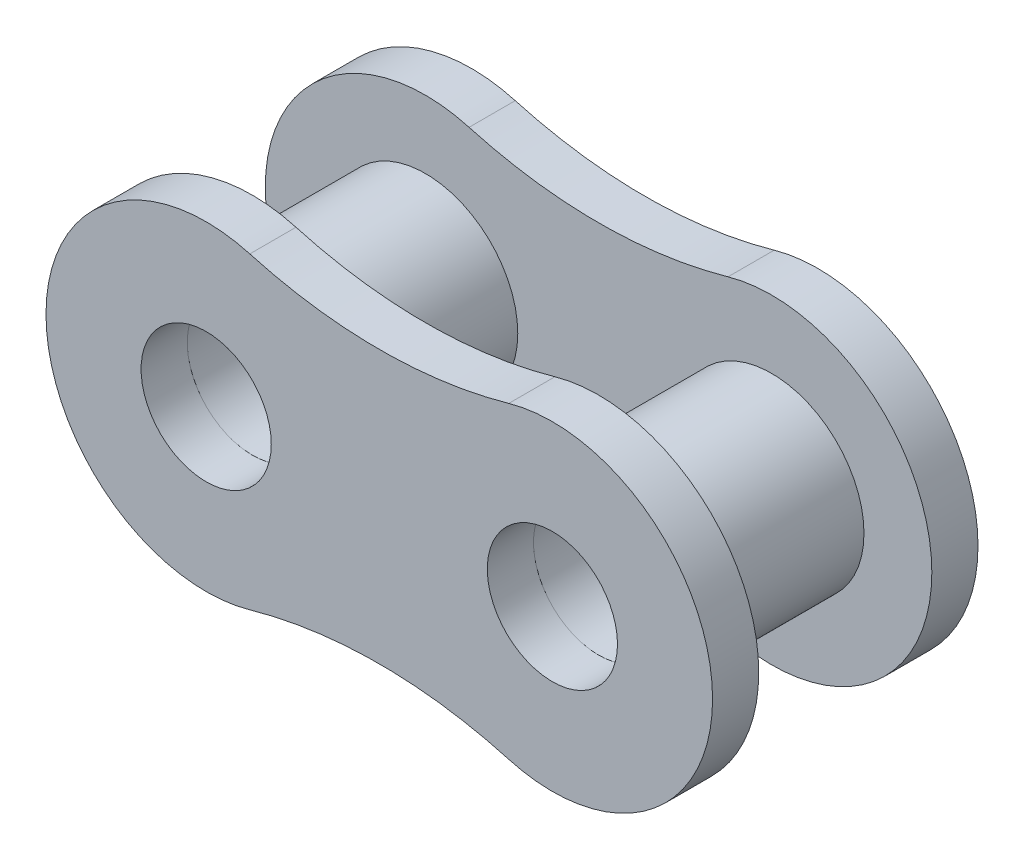
ISO-10303-21;
HEADER;
FILE_DESCRIPTION(('STEP AP214'),'2;1');
FILE_NAME('part.step','',(''),(''),'','','');
FILE_SCHEMA(('AUTOMOTIVE_DESIGN { 1 0 10303 214 1 1 1 1 }'));
ENDSEC;
DATA;
#1=APPLICATION_CONTEXT('core data for automotive mechanical design processes');
#2=APPLICATION_PROTOCOL_DEFINITION('international standard','automotive_design',2000,#1);
#3=PRODUCT_CONTEXT('',#1,'mechanical');
#4=PRODUCT('Part','Part','',(#3));
#5=PRODUCT_RELATED_PRODUCT_CATEGORY('part','',(#4));
#6=PRODUCT_DEFINITION_FORMATION('','',#4);
#7=PRODUCT_DEFINITION_CONTEXT('part definition',#1,'design');
#8=PRODUCT_DEFINITION('design','',#6,#7);
#9=PRODUCT_DEFINITION_SHAPE('','',#8);
#10=(LENGTH_UNIT() NAMED_UNIT(*) SI_UNIT(.MILLI.,.METRE.));
#11=(NAMED_UNIT(*) PLANE_ANGLE_UNIT() SI_UNIT($,.RADIAN.));
#12=(NAMED_UNIT(*) SI_UNIT($,.STERADIAN.) SOLID_ANGLE_UNIT());
#13=UNCERTAINTY_MEASURE_WITH_UNIT(LENGTH_MEASURE(1.E-05),#10,'distance_accuracy_value','');
#14=(GEOMETRIC_REPRESENTATION_CONTEXT(3) GLOBAL_UNCERTAINTY_ASSIGNED_CONTEXT((#13)) GLOBAL_UNIT_ASSIGNED_CONTEXT((#10,
#11,#12)) REPRESENTATION_CONTEXT('',''));
#15=CARTESIAN_POINT('',(0.,0.,0.));
#16=DIRECTION('',(0.,0.,1.));
#17=DIRECTION('',(1.,0.,0.));
#18=AXIS2_PLACEMENT_3D('',#15,#16,#17);
#19=CARTESIAN_POINT('',(2.38125,8.41273116354467,-2.38125));
#20=DIRECTION('',(0.,0.,-1.));
#21=DIRECTION('',(1.,0.,0.));
#22=AXIS2_PLACEMENT_3D('',#19,#20,#21);
#23=PLANE('',#22);
#24=CARTESIAN_POINT('',(0.,16.8254623270893,-2.38125));
#25=DIRECTION('',(0.,0.,-1.));
#26=DIRECTION('',(1.,0.,0.));
#27=AXIS2_PLACEMENT_3D('',#24,#25,#26);
#28=CIRCLE('',#27,13.0795973270893);
#29=CARTESIAN_POINT('',(3.56226756594436,4.24030773815307,-2.38125));
#30=VERTEX_POINT('',#29);
#31=CARTESIAN_POINT('',(-3.56226756594436,4.24030773815307,-2.38125));
#32=VERTEX_POINT('',#31);
#33=EDGE_CURVE('E160',#30,#32,#28,.T.);
#34=ORIENTED_EDGE('',*,*,#33,.T.);
#35=CARTESIAN_POINT('',(-4.7625,0.,-2.38125));
#36=DIRECTION('',(0.,0.,1.));
#37=DIRECTION('',(1.,0.,0.));
#38=AXIS2_PLACEMENT_3D('',#35,#36,#37);
#39=CIRCLE('',#38,4.4069);
#40=CARTESIAN_POINT('',(-3.56226756594436,-4.24030773815307,-2.38125));
#41=VERTEX_POINT('',#40);
#42=EDGE_CURVE('E174',#32,#41,#39,.T.);
#43=ORIENTED_EDGE('',*,*,#42,.T.);
#44=CARTESIAN_POINT('',(0.,-16.8254623270893,-2.38125));
#45=DIRECTION('',(0.,0.,-1.));
#46=DIRECTION('',(1.,0.,0.));
#47=AXIS2_PLACEMENT_3D('',#44,#45,#46);
#48=CIRCLE('',#47,13.0795973270893);
#49=CARTESIAN_POINT('',(3.56226756594435,-4.24030773815307,-2.38125));
#50=VERTEX_POINT('',#49);
#51=EDGE_CURVE('E177',#41,#50,#48,.T.);
#52=ORIENTED_EDGE('',*,*,#51,.T.);
#53=CARTESIAN_POINT('',(4.7625,0.,-2.38125));
#54=DIRECTION('',(0.,0.,1.));
#55=DIRECTION('',(1.,0.,0.));
#56=AXIS2_PLACEMENT_3D('',#53,#54,#55);
#57=CIRCLE('',#56,4.4069);
#58=EDGE_CURVE('E166',#50,#30,#57,.T.);
#59=ORIENTED_EDGE('',*,*,#58,.T.);
#60=EDGE_LOOP('',(#34,#43,#52,#59));
#61=FACE_BOUND('',#60,.T.);
#62=CARTESIAN_POINT('',(-4.7625,0.,-2.38125));
#63=DIRECTION('',(0.,0.,-1.));
#64=DIRECTION('',(-1.,0.,0.));
#65=AXIS2_PLACEMENT_3D('',#62,#63,#64);
#66=CIRCLE('',#65,2.54);
#67=CARTESIAN_POINT('',(-7.3025,0.,-2.38125));
#68=VERTEX_POINT('',#67);
#69=EDGE_CURVE('E48',#68,#68,#66,.F.);
#70=ORIENTED_EDGE('',*,*,#69,.F.);
#71=EDGE_LOOP('',(#70));
#72=FACE_BOUND('',#71,.T.);
#73=CARTESIAN_POINT('',(4.7625,0.,-2.38125));
#74=DIRECTION('',(0.,0.,-1.));
#75=DIRECTION('',(-1.,0.,0.));
#76=AXIS2_PLACEMENT_3D('',#73,#74,#75);
#77=CIRCLE('',#76,2.54);
#78=CARTESIAN_POINT('',(2.2225,0.,-2.38125));
#79=VERTEX_POINT('',#78);
#80=EDGE_CURVE('E11',#79,#79,#77,.F.);
#81=ORIENTED_EDGE('',*,*,#80,.F.);
#82=EDGE_LOOP('',(#81));
#83=FACE_BOUND('',#82,.T.);
#84=ADVANCED_FACE('F39',(#61,#72,#83),#23,.F.);
#85=CARTESIAN_POINT('',(4.7625,0.,-2.38125));
#86=DIRECTION('',(0.,0.,1.));
#87=DIRECTION('',(1.,0.,0.));
#88=AXIS2_PLACEMENT_3D('',#85,#86,#87);
#89=CIRCLE('',#88,1.8161);
#90=CARTESIAN_POINT('',(2.9464,0.,-2.38125));
#91=VERTEX_POINT('',#90);
#92=EDGE_CURVE('E278',#91,#91,#89,.T.);
#93=ORIENTED_EDGE('',*,*,#92,.T.);
#94=EDGE_LOOP('',(#93));
#95=FACE_BOUND('',#94,.T.);
#96=CARTESIAN_POINT('',(4.7625,0.,-2.38125));
#97=DIRECTION('',(0.,0.,1.));
#98=DIRECTION('',(1.,0.,0.));
#99=AXIS2_PLACEMENT_3D('',#96,#97,#98);
#100=CIRCLE('',#99,1.7907);
#101=CARTESIAN_POINT('',(6.5532,0.,-2.38125));
#102=VERTEX_POINT('',#101);
#103=EDGE_CURVE('E150',#102,#102,#100,.T.);
#104=ORIENTED_EDGE('',*,*,#103,.F.);
#105=EDGE_LOOP('',(#104));
#106=FACE_BOUND('',#105,.T.);
#107=ADVANCED_FACE('F192',(#95,#106),#23,.F.);
#108=CARTESIAN_POINT('',(2.38125,8.41273116354467,-3.65125));
#109=DIRECTION('',(0.,0.,-1.));
#110=DIRECTION('',(1.,0.,0.));
#111=AXIS2_PLACEMENT_3D('',#108,#109,#110);
#112=PLANE('',#111);
#113=CARTESIAN_POINT('',(-4.7625,0.,-3.65125));
#114=DIRECTION('',(0.,0.,1.));
#115=DIRECTION('',(1.,0.,0.));
#116=AXIS2_PLACEMENT_3D('',#113,#114,#115);
#117=CIRCLE('',#116,1.7907);
#118=CARTESIAN_POINT('',(-2.9718,0.,-3.65125));
#119=VERTEX_POINT('',#118);
#120=EDGE_CURVE('E157',#119,#119,#117,.T.);
#121=ORIENTED_EDGE('',*,*,#120,.T.);
#122=EDGE_LOOP('',(#121));
#123=FACE_BOUND('',#122,.T.);
#124=CARTESIAN_POINT('',(0.,16.8254623270893,-3.65125));
#125=DIRECTION('',(0.,0.,-1.));
#126=DIRECTION('',(1.,0.,0.));
#127=AXIS2_PLACEMENT_3D('',#124,#125,#126);
#128=CIRCLE('',#127,13.0795973270893);
#129=CARTESIAN_POINT('',(3.56226756594436,4.24030773815307,-3.65125));
#130=VERTEX_POINT('',#129);
#131=CARTESIAN_POINT('',(-3.56226756594436,4.24030773815307,-3.65125));
#132=VERTEX_POINT('',#131);
#133=EDGE_CURVE('E163',#130,#132,#128,.T.);
#134=ORIENTED_EDGE('',*,*,#133,.F.);
#135=CARTESIAN_POINT('',(4.7625,0.,-3.65125));
#136=DIRECTION('',(0.,0.,1.));
#137=DIRECTION('',(1.,0.,0.));
#138=AXIS2_PLACEMENT_3D('',#135,#136,#137);
#139=CIRCLE('',#138,4.4069);
#140=CARTESIAN_POINT('',(3.56226756594435,-4.24030773815307,-3.65125));
#141=VERTEX_POINT('',#140);
#142=EDGE_CURVE('E170',#141,#130,#139,.T.);
#143=ORIENTED_EDGE('',*,*,#142,.F.);
#144=CARTESIAN_POINT('',(0.,-16.8254623270893,-3.65125));
#145=DIRECTION('',(0.,0.,-1.));
#146=DIRECTION('',(1.,0.,0.));
#147=AXIS2_PLACEMENT_3D('',#144,#145,#146);
#148=CIRCLE('',#147,13.0795973270893);
#149=CARTESIAN_POINT('',(-3.56226756594436,-4.24030773815307,-3.65125));
#150=VERTEX_POINT('',#149);
#151=EDGE_CURVE('E168',#150,#141,#148,.T.);
#152=ORIENTED_EDGE('',*,*,#151,.F.);
#153=CARTESIAN_POINT('',(-4.7625,0.,-3.65125));
#154=DIRECTION('',(0.,0.,1.));
#155=DIRECTION('',(1.,0.,0.));
#156=AXIS2_PLACEMENT_3D('',#153,#154,#155);
#157=CIRCLE('',#156,4.4069);
#158=EDGE_CURVE('E165',#132,#150,#157,.T.);
#159=ORIENTED_EDGE('',*,*,#158,.F.);
#160=EDGE_LOOP('',(#134,#143,#152,#159));
#161=FACE_BOUND('',#160,.T.);
#162=CARTESIAN_POINT('',(4.7625,0.,-3.65125));
#163=DIRECTION('',(0.,0.,1.));
#164=DIRECTION('',(1.,0.,0.));
#165=AXIS2_PLACEMENT_3D('',#162,#163,#164);
#166=CIRCLE('',#165,1.7907);
#167=CARTESIAN_POINT('',(6.5532,0.,-3.65125));
#168=VERTEX_POINT('',#167);
#169=EDGE_CURVE('E151',#168,#168,#166,.T.);
#170=ORIENTED_EDGE('',*,*,#169,.T.);
#171=EDGE_LOOP('',(#170));
#172=FACE_BOUND('',#171,.T.);
#173=ADVANCED_FACE('F248',(#123,#161,#172),#112,.T.);
#174=CARTESIAN_POINT('',(-4.7625,0.,-2.38125));
#175=DIRECTION('',(0.,0.,1.));
#176=DIRECTION('',(1.,0.,0.));
#177=AXIS2_PLACEMENT_3D('',#174,#175,#176);
#178=CIRCLE('',#177,1.8161);
#179=CARTESIAN_POINT('',(-6.5786,0.,-2.38125));
#180=VERTEX_POINT('',#179);
#181=EDGE_CURVE('E287',#180,#180,#178,.T.);
#182=ORIENTED_EDGE('',*,*,#181,.T.);
#183=EDGE_LOOP('',(#182));
#184=FACE_BOUND('',#183,.T.);
#185=CARTESIAN_POINT('',(-4.7625,0.,-2.38125));
#186=DIRECTION('',(0.,0.,1.));
#187=DIRECTION('',(1.,0.,0.));
#188=AXIS2_PLACEMENT_3D('',#185,#186,#187);
#189=CIRCLE('',#188,1.7907);
#190=CARTESIAN_POINT('',(-2.9718,0.,-2.38125));
#191=VERTEX_POINT('',#190);
#192=EDGE_CURVE('E154',#191,#191,#189,.T.);
#193=ORIENTED_EDGE('',*,*,#192,.F.);
#194=EDGE_LOOP('',(#193));
#195=FACE_BOUND('',#194,.T.);
#196=ADVANCED_FACE('F195',(#184,#195),#23,.F.);
#197=CARTESIAN_POINT('',(0.,16.8254623270893,-3.65125));
#198=DIRECTION('',(0.,0.,1.));
#199=DIRECTION('',(-1.,0.,0.));
#200=AXIS2_PLACEMENT_3D('',#197,#198,#199);
#201=CYLINDRICAL_SURFACE('',#200,13.0795973270893);
#202=ORIENTED_EDGE('',*,*,#33,.F.);
#203=DIRECTION('',(0.,0.,1.));
#204=VECTOR('',#203,1.);
#205=CARTESIAN_POINT('',(3.56226756594436,4.24030773815307,-3.65125));
#206=LINE('',#205,#204);
#207=EDGE_CURVE('E56',#130,#30,#206,.T.);
#208=ORIENTED_EDGE('',*,*,#207,.F.);
#209=ORIENTED_EDGE('',*,*,#133,.T.);
#210=DIRECTION('',(0.,0.,1.));
#211=VECTOR('',#210,1.);
#212=CARTESIAN_POINT('',(-3.56226756594436,4.24030773815307,-3.65125));
#213=LINE('',#212,#211);
#214=EDGE_CURVE('E84',#132,#32,#213,.T.);
#215=ORIENTED_EDGE('',*,*,#214,.T.);
#216=EDGE_LOOP('',(#202,#208,#209,#215));
#217=FACE_BOUND('',#216,.T.);
#218=ADVANCED_FACE('F41',(#217),#201,.F.);
#219=CARTESIAN_POINT('',(-4.7625,0.,-3.65125));
#220=DIRECTION('',(0.,0.,1.));
#221=DIRECTION('',(-1.,0.,0.));
#222=AXIS2_PLACEMENT_3D('',#219,#220,#221);
#223=CYLINDRICAL_SURFACE('',#222,4.4069);
#224=ORIENTED_EDGE('',*,*,#42,.F.);
#225=ORIENTED_EDGE('',*,*,#214,.F.);
#226=ORIENTED_EDGE('',*,*,#158,.T.);
#227=DIRECTION('',(0.,0.,1.));
#228=VECTOR('',#227,1.);
#229=CARTESIAN_POINT('',(-3.56226756594436,-4.24030773815307,-3.65125));
#230=LINE('',#229,#228);
#231=EDGE_CURVE('E183',#150,#41,#230,.T.);
#232=ORIENTED_EDGE('',*,*,#231,.T.);
#233=EDGE_LOOP('',(#224,#225,#226,#232));
#234=FACE_BOUND('',#233,.T.);
#235=ADVANCED_FACE('F258',(#234),#223,.T.);
#236=CARTESIAN_POINT('',(0.,-16.8254623270893,-3.65125));
#237=DIRECTION('',(0.,0.,1.));
#238=DIRECTION('',(-1.,0.,0.));
#239=AXIS2_PLACEMENT_3D('',#236,#237,#238);
#240=CYLINDRICAL_SURFACE('',#239,13.0795973270893);
#241=ORIENTED_EDGE('',*,*,#51,.F.);
#242=ORIENTED_EDGE('',*,*,#231,.F.);
#243=ORIENTED_EDGE('',*,*,#151,.T.);
#244=DIRECTION('',(0.,0.,1.));
#245=VECTOR('',#244,1.);
#246=CARTESIAN_POINT('',(3.56226756594435,-4.24030773815307,-3.65125));
#247=LINE('',#246,#245);
#248=EDGE_CURVE('E74',#141,#50,#247,.T.);
#249=ORIENTED_EDGE('',*,*,#248,.T.);
#250=EDGE_LOOP('',(#241,#242,#243,#249));
#251=FACE_BOUND('',#250,.T.);
#252=ADVANCED_FACE('F256',(#251),#240,.F.);
#253=CARTESIAN_POINT('',(4.7625,0.,-3.65125));
#254=DIRECTION('',(0.,0.,1.));
#255=DIRECTION('',(-1.,0.,0.));
#256=AXIS2_PLACEMENT_3D('',#253,#254,#255);
#257=CYLINDRICAL_SURFACE('',#256,4.4069);
#258=ORIENTED_EDGE('',*,*,#58,.F.);
#259=ORIENTED_EDGE('',*,*,#248,.F.);
#260=ORIENTED_EDGE('',*,*,#142,.T.);
#261=ORIENTED_EDGE('',*,*,#207,.T.);
#262=EDGE_LOOP('',(#258,#259,#260,#261));
#263=FACE_BOUND('',#262,.T.);
#264=ADVANCED_FACE('F246',(#263),#257,.T.);
#265=CARTESIAN_POINT('',(-4.7625,0.,-3.65125));
#266=DIRECTION('',(0.,0.,1.));
#267=DIRECTION('',(-1.,0.,0.));
#268=AXIS2_PLACEMENT_3D('',#265,#266,#267);
#269=CYLINDRICAL_SURFACE('',#268,1.7907);
#270=ORIENTED_EDGE('',*,*,#120,.F.);
#271=EDGE_LOOP('',(#270));
#272=FACE_BOUND('',#271,.T.);
#273=ORIENTED_EDGE('',*,*,#192,.T.);
#274=EDGE_LOOP('',(#273));
#275=FACE_BOUND('',#274,.T.);
#276=ADVANCED_FACE('F242',(#272,#275),#269,.F.);
#277=CARTESIAN_POINT('',(4.7625,0.,-3.65125));
#278=DIRECTION('',(0.,0.,1.));
#279=DIRECTION('',(-1.,0.,0.));
#280=AXIS2_PLACEMENT_3D('',#277,#278,#279);
#281=CYLINDRICAL_SURFACE('',#280,1.7907);
#282=ORIENTED_EDGE('',*,*,#169,.F.);
#283=EDGE_LOOP('',(#282));
#284=FACE_BOUND('',#283,.T.);
#285=ORIENTED_EDGE('',*,*,#103,.T.);
#286=EDGE_LOOP('',(#285));
#287=FACE_BOUND('',#286,.T.);
#288=ADVANCED_FACE('F239',(#284,#287),#281,.F.);
#289=CARTESIAN_POINT('',(2.38125,8.41273116354467,2.38125));
#290=DIRECTION('',(0.,0.,1.));
#291=DIRECTION('',(1.,0.,0.));
#292=AXIS2_PLACEMENT_3D('',#289,#290,#291);
#293=PLANE('',#292);
#294=CARTESIAN_POINT('',(0.,16.8254623270893,2.38125));
#295=DIRECTION('',(0.,0.,-1.));
#296=DIRECTION('',(1.,0.,0.));
#297=AXIS2_PLACEMENT_3D('',#294,#295,#296);
#298=CIRCLE('',#297,13.0795973270893);
#299=CARTESIAN_POINT('',(3.56226756594436,4.24030773815307,2.38125));
#300=VERTEX_POINT('',#299);
#301=CARTESIAN_POINT('',(-3.56226756594436,4.24030773815307,2.38125));
#302=VERTEX_POINT('',#301);
#303=EDGE_CURVE('E138',#300,#302,#298,.T.);
#304=ORIENTED_EDGE('',*,*,#303,.F.);
#305=CARTESIAN_POINT('',(4.7625,0.,2.38125));
#306=DIRECTION('',(0.,0.,1.));
#307=DIRECTION('',(1.,0.,0.));
#308=AXIS2_PLACEMENT_3D('',#305,#306,#307);
#309=CIRCLE('',#308,4.4069);
#310=CARTESIAN_POINT('',(3.56226756594435,-4.24030773815307,2.38125));
#311=VERTEX_POINT('',#310);
#312=EDGE_CURVE('E134',#311,#300,#309,.T.);
#313=ORIENTED_EDGE('',*,*,#312,.F.);
#314=CARTESIAN_POINT('',(0.,-16.8254623270893,2.38125));
#315=DIRECTION('',(0.,0.,-1.));
#316=DIRECTION('',(1.,0.,0.));
#317=AXIS2_PLACEMENT_3D('',#314,#315,#316);
#318=CIRCLE('',#317,13.0795973270893);
#319=CARTESIAN_POINT('',(-3.56226756594436,-4.24030773815307,2.38125));
#320=VERTEX_POINT('',#319);
#321=EDGE_CURVE('E308',#320,#311,#318,.T.);
#322=ORIENTED_EDGE('',*,*,#321,.F.);
#323=CARTESIAN_POINT('',(-4.7625,0.,2.38125));
#324=DIRECTION('',(0.,0.,1.));
#325=DIRECTION('',(1.,0.,0.));
#326=AXIS2_PLACEMENT_3D('',#323,#324,#325);
#327=CIRCLE('',#326,4.4069);
#328=EDGE_CURVE('E306',#302,#320,#327,.T.);
#329=ORIENTED_EDGE('',*,*,#328,.F.);
#330=EDGE_LOOP('',(#304,#313,#322,#329));
#331=FACE_BOUND('',#330,.T.);
#332=CARTESIAN_POINT('',(4.7625,0.,2.38125));
#333=DIRECTION('',(0.,0.,1.));
#334=DIRECTION('',(1.,0.,0.));
#335=AXIS2_PLACEMENT_3D('',#332,#333,#334);
#336=CIRCLE('',#335,2.54);
#337=CARTESIAN_POINT('',(2.2225,0.,2.38125));
#338=VERTEX_POINT('',#337);
#339=EDGE_CURVE('E139',#338,#338,#336,.F.);
#340=ORIENTED_EDGE('',*,*,#339,.F.);
#341=EDGE_LOOP('',(#340));
#342=FACE_BOUND('',#341,.T.);
#343=CARTESIAN_POINT('',(-4.7625,0.,2.38125));
#344=DIRECTION('',(0.,0.,1.));
#345=DIRECTION('',(1.,0.,0.));
#346=AXIS2_PLACEMENT_3D('',#343,#344,#345);
#347=CIRCLE('',#346,2.54);
#348=CARTESIAN_POINT('',(-7.3025,0.,2.38125));
#349=VERTEX_POINT('',#348);
#350=EDGE_CURVE('E142',#349,#349,#347,.F.);
#351=ORIENTED_EDGE('',*,*,#350,.F.);
#352=EDGE_LOOP('',(#351));
#353=FACE_BOUND('',#352,.T.);
#354=ADVANCED_FACE('F227',(#331,#342,#353),#293,.F.);
#355=CARTESIAN_POINT('',(-4.7625,0.,2.38125));
#356=DIRECTION('',(0.,0.,1.));
#357=DIRECTION('',(1.,0.,0.));
#358=AXIS2_PLACEMENT_3D('',#355,#356,#357);
#359=CIRCLE('',#358,1.8161);
#360=CARTESIAN_POINT('',(-6.5786,0.,2.38125));
#361=VERTEX_POINT('',#360);
#362=EDGE_CURVE('E281',#361,#361,#359,.T.);
#363=ORIENTED_EDGE('',*,*,#362,.F.);
#364=EDGE_LOOP('',(#363));
#365=FACE_BOUND('',#364,.T.);
#366=CARTESIAN_POINT('',(-4.7625,0.,2.38125));
#367=DIRECTION('',(0.,0.,1.));
#368=DIRECTION('',(1.,0.,0.));
#369=AXIS2_PLACEMENT_3D('',#366,#367,#368);
#370=CIRCLE('',#369,1.7907);
#371=CARTESIAN_POINT('',(-2.9718,0.,2.38125));
#372=VERTEX_POINT('',#371);
#373=EDGE_CURVE('E294',#372,#372,#370,.T.);
#374=ORIENTED_EDGE('',*,*,#373,.T.);
#375=EDGE_LOOP('',(#374));
#376=FACE_BOUND('',#375,.T.);
#377=ADVANCED_FACE('F222',(#365,#376),#293,.F.);
#378=CARTESIAN_POINT('',(2.38125,8.41273116354467,3.65125));
#379=DIRECTION('',(0.,0.,1.));
#380=DIRECTION('',(1.,0.,0.));
#381=AXIS2_PLACEMENT_3D('',#378,#379,#380);
#382=PLANE('',#381);
#383=CARTESIAN_POINT('',(-4.7625,0.,3.65125));
#384=DIRECTION('',(0.,0.,1.));
#385=DIRECTION('',(1.,0.,0.));
#386=AXIS2_PLACEMENT_3D('',#383,#384,#385);
#387=CIRCLE('',#386,1.7907);
#388=CARTESIAN_POINT('',(-2.9718,0.,3.65125));
#389=VERTEX_POINT('',#388);
#390=EDGE_CURVE('E297',#389,#389,#387,.T.);
#391=ORIENTED_EDGE('',*,*,#390,.F.);
#392=EDGE_LOOP('',(#391));
#393=FACE_BOUND('',#392,.T.);
#394=CARTESIAN_POINT('',(0.,16.8254623270893,3.65125));
#395=DIRECTION('',(0.,0.,-1.));
#396=DIRECTION('',(1.,0.,0.));
#397=AXIS2_PLACEMENT_3D('',#394,#395,#396);
#398=CIRCLE('',#397,13.0795973270893);
#399=CARTESIAN_POINT('',(3.56226756594436,4.24030773815307,3.65125));
#400=VERTEX_POINT('',#399);
#401=CARTESIAN_POINT('',(-3.56226756594436,4.24030773815307,3.65125));
#402=VERTEX_POINT('',#401);
#403=EDGE_CURVE('E124',#400,#402,#398,.T.);
#404=ORIENTED_EDGE('',*,*,#403,.T.);
#405=CARTESIAN_POINT('',(-4.7625,0.,3.65125));
#406=DIRECTION('',(0.,0.,1.));
#407=DIRECTION('',(1.,0.,0.));
#408=AXIS2_PLACEMENT_3D('',#405,#406,#407);
#409=CIRCLE('',#408,4.4069);
#410=CARTESIAN_POINT('',(-3.56226756594436,-4.24030773815307,3.65125));
#411=VERTEX_POINT('',#410);
#412=EDGE_CURVE('E113',#402,#411,#409,.T.);
#413=ORIENTED_EDGE('',*,*,#412,.T.);
#414=CARTESIAN_POINT('',(0.,-16.8254623270893,3.65125));
#415=DIRECTION('',(0.,0.,-1.));
#416=DIRECTION('',(1.,0.,0.));
#417=AXIS2_PLACEMENT_3D('',#414,#415,#416);
#418=CIRCLE('',#417,13.0795973270893);
#419=CARTESIAN_POINT('',(3.56226756594435,-4.24030773815307,3.65125));
#420=VERTEX_POINT('',#419);
#421=EDGE_CURVE('E123',#411,#420,#418,.T.);
#422=ORIENTED_EDGE('',*,*,#421,.T.);
#423=CARTESIAN_POINT('',(4.7625,0.,3.65125));
#424=DIRECTION('',(0.,0.,1.));
#425=DIRECTION('',(1.,0.,0.));
#426=AXIS2_PLACEMENT_3D('',#423,#424,#425);
#427=CIRCLE('',#426,4.4069);
#428=EDGE_CURVE('E130',#420,#400,#427,.T.);
#429=ORIENTED_EDGE('',*,*,#428,.T.);
#430=EDGE_LOOP('',(#404,#413,#422,#429));
#431=FACE_BOUND('',#430,.T.);
#432=CARTESIAN_POINT('',(4.7625,0.,3.65125));
#433=DIRECTION('',(0.,0.,1.));
#434=DIRECTION('',(1.,0.,0.));
#435=AXIS2_PLACEMENT_3D('',#432,#433,#434);
#436=CIRCLE('',#435,1.7907);
#437=CARTESIAN_POINT('',(6.5532,0.,3.65125));
#438=VERTEX_POINT('',#437);
#439=EDGE_CURVE('E291',#438,#438,#436,.T.);
#440=ORIENTED_EDGE('',*,*,#439,.F.);
#441=EDGE_LOOP('',(#440));
#442=FACE_BOUND('',#441,.T.);
#443=ADVANCED_FACE('F127',(#393,#431,#442),#382,.T.);
#444=CARTESIAN_POINT('',(4.7625,0.,2.38125));
#445=DIRECTION('',(0.,0.,1.));
#446=DIRECTION('',(1.,0.,0.));
#447=AXIS2_PLACEMENT_3D('',#444,#445,#446);
#448=CIRCLE('',#447,1.8161);
#449=CARTESIAN_POINT('',(2.9464,0.,2.38125));
#450=VERTEX_POINT('',#449);
#451=EDGE_CURVE('E280',#450,#450,#448,.T.);
#452=ORIENTED_EDGE('',*,*,#451,.F.);
#453=EDGE_LOOP('',(#452));
#454=FACE_BOUND('',#453,.T.);
#455=CARTESIAN_POINT('',(4.7625,0.,2.38125));
#456=DIRECTION('',(0.,0.,1.));
#457=DIRECTION('',(1.,0.,0.));
#458=AXIS2_PLACEMENT_3D('',#455,#456,#457);
#459=CIRCLE('',#458,1.7907);
#460=CARTESIAN_POINT('',(6.5532,0.,2.38125));
#461=VERTEX_POINT('',#460);
#462=EDGE_CURVE('E284',#461,#461,#459,.T.);
#463=ORIENTED_EDGE('',*,*,#462,.T.);
#464=EDGE_LOOP('',(#463));
#465=FACE_BOUND('',#464,.T.);
#466=ADVANCED_FACE('F221',(#454,#465),#293,.F.);
#467=CARTESIAN_POINT('',(0.,16.8254623270893,3.65125));
#468=DIRECTION('',(0.,0.,-1.));
#469=DIRECTION('',(-1.,0.,0.));
#470=AXIS2_PLACEMENT_3D('',#467,#468,#469);
#471=CYLINDRICAL_SURFACE('',#470,13.0795973270893);
#472=ORIENTED_EDGE('',*,*,#303,.T.);
#473=DIRECTION('',(0.,0.,-1.));
#474=VECTOR('',#473,1.);
#475=CARTESIAN_POINT('',(-3.56226756594436,4.24030773815307,3.65125));
#476=LINE('',#475,#474);
#477=EDGE_CURVE('E117',#402,#302,#476,.T.);
#478=ORIENTED_EDGE('',*,*,#477,.F.);
#479=ORIENTED_EDGE('',*,*,#403,.F.);
#480=DIRECTION('',(0.,0.,-1.));
#481=VECTOR('',#480,1.);
#482=CARTESIAN_POINT('',(3.56226756594436,4.24030773815307,3.65125));
#483=LINE('',#482,#481);
#484=EDGE_CURVE('E304',#400,#300,#483,.T.);
#485=ORIENTED_EDGE('',*,*,#484,.T.);
#486=EDGE_LOOP('',(#472,#478,#479,#485));
#487=FACE_BOUND('',#486,.T.);
#488=ADVANCED_FACE('F136',(#487),#471,.F.);
#489=CARTESIAN_POINT('',(-4.7625,0.,3.65125));
#490=DIRECTION('',(0.,0.,-1.));
#491=DIRECTION('',(-1.,0.,0.));
#492=AXIS2_PLACEMENT_3D('',#489,#490,#491);
#493=CYLINDRICAL_SURFACE('',#492,4.4069);
#494=ORIENTED_EDGE('',*,*,#328,.T.);
#495=DIRECTION('',(0.,0.,-1.));
#496=VECTOR('',#495,1.);
#497=CARTESIAN_POINT('',(-3.56226756594436,-4.24030773815307,3.65125));
#498=LINE('',#497,#496);
#499=EDGE_CURVE('E120',#411,#320,#498,.T.);
#500=ORIENTED_EDGE('',*,*,#499,.F.);
#501=ORIENTED_EDGE('',*,*,#412,.F.);
#502=ORIENTED_EDGE('',*,*,#477,.T.);
#503=EDGE_LOOP('',(#494,#500,#501,#502));
#504=FACE_BOUND('',#503,.T.);
#505=ADVANCED_FACE('F115',(#504),#493,.T.);
#506=CARTESIAN_POINT('',(0.,-16.8254623270893,3.65125));
#507=DIRECTION('',(0.,0.,-1.));
#508=DIRECTION('',(-1.,0.,0.));
#509=AXIS2_PLACEMENT_3D('',#506,#507,#508);
#510=CYLINDRICAL_SURFACE('',#509,13.0795973270893);
#511=ORIENTED_EDGE('',*,*,#321,.T.);
#512=DIRECTION('',(0.,0.,-1.));
#513=VECTOR('',#512,1.);
#514=CARTESIAN_POINT('',(3.56226756594435,-4.24030773815307,3.65125));
#515=LINE('',#514,#513);
#516=EDGE_CURVE('E144',#420,#311,#515,.T.);
#517=ORIENTED_EDGE('',*,*,#516,.F.);
#518=ORIENTED_EDGE('',*,*,#421,.F.);
#519=ORIENTED_EDGE('',*,*,#499,.T.);
#520=EDGE_LOOP('',(#511,#517,#518,#519));
#521=FACE_BOUND('',#520,.T.);
#522=ADVANCED_FACE('F230',(#521),#510,.F.);
#523=CARTESIAN_POINT('',(4.7625,0.,3.65125));
#524=DIRECTION('',(0.,0.,-1.));
#525=DIRECTION('',(-1.,0.,0.));
#526=AXIS2_PLACEMENT_3D('',#523,#524,#525);
#527=CYLINDRICAL_SURFACE('',#526,4.4069);
#528=ORIENTED_EDGE('',*,*,#312,.T.);
#529=ORIENTED_EDGE('',*,*,#484,.F.);
#530=ORIENTED_EDGE('',*,*,#428,.F.);
#531=ORIENTED_EDGE('',*,*,#516,.T.);
#532=EDGE_LOOP('',(#528,#529,#530,#531));
#533=FACE_BOUND('',#532,.T.);
#534=ADVANCED_FACE('F217',(#533),#527,.T.);
#535=CARTESIAN_POINT('',(-4.7625,0.,3.65125));
#536=DIRECTION('',(0.,0.,-1.));
#537=DIRECTION('',(-1.,0.,0.));
#538=AXIS2_PLACEMENT_3D('',#535,#536,#537);
#539=CYLINDRICAL_SURFACE('',#538,1.7907);
#540=ORIENTED_EDGE('',*,*,#390,.T.);
#541=EDGE_LOOP('',(#540));
#542=FACE_BOUND('',#541,.T.);
#543=ORIENTED_EDGE('',*,*,#373,.F.);
#544=EDGE_LOOP('',(#543));
#545=FACE_BOUND('',#544,.T.);
#546=ADVANCED_FACE('F210',(#542,#545),#539,.F.);
#547=CARTESIAN_POINT('',(4.7625,0.,3.65125));
#548=DIRECTION('',(0.,0.,-1.));
#549=DIRECTION('',(-1.,0.,0.));
#550=AXIS2_PLACEMENT_3D('',#547,#548,#549);
#551=CYLINDRICAL_SURFACE('',#550,1.7907);
#552=ORIENTED_EDGE('',*,*,#439,.T.);
#553=EDGE_LOOP('',(#552));
#554=FACE_BOUND('',#553,.T.);
#555=ORIENTED_EDGE('',*,*,#462,.F.);
#556=EDGE_LOOP('',(#555));
#557=FACE_BOUND('',#556,.T.);
#558=ADVANCED_FACE('F201',(#554,#557),#551,.F.);
#559=CARTESIAN_POINT('',(4.7625,0.,2.38125));
#560=DIRECTION('',(0.,0.,-1.));
#561=DIRECTION('',(-1.,0.,0.));
#562=AXIS2_PLACEMENT_3D('',#559,#560,#561);
#563=CYLINDRICAL_SURFACE('',#562,2.54);
#564=CARTESIAN_POINT('',(2.2225,0.,2.38125));
#565=CARTESIAN_POINT('',(2.2225,0.,2.331640625));
#566=CARTESIAN_POINT('',(2.2225,0.,2.28203125));
#567=CARTESIAN_POINT('',(2.2225,0.,2.1828125));
#568=CARTESIAN_POINT('',(2.2225,0.,2.133203125));
#569=CARTESIAN_POINT('',(2.2225,0.,2.033984375));
#570=CARTESIAN_POINT('',(2.2225,0.,1.984375));
#571=CARTESIAN_POINT('',(2.2225,0.,1.88515625));
#572=CARTESIAN_POINT('',(2.2225,0.,1.835546875));
#573=CARTESIAN_POINT('',(2.2225,0.,1.736328125));
#574=CARTESIAN_POINT('',(2.2225,0.,1.68671875));
#575=CARTESIAN_POINT('',(2.2225,0.,1.5875));
#576=CARTESIAN_POINT('',(2.2225,0.,1.537890625));
#577=CARTESIAN_POINT('',(2.2225,0.,1.438671875));
#578=CARTESIAN_POINT('',(2.2225,0.,1.3890625));
#579=CARTESIAN_POINT('',(2.2225,0.,1.28984375));
#580=CARTESIAN_POINT('',(2.2225,0.,1.240234375));
#581=CARTESIAN_POINT('',(2.2225,0.,1.141015625));
#582=CARTESIAN_POINT('',(2.2225,0.,1.09140625));
#583=CARTESIAN_POINT('',(2.2225,0.,0.9921875));
#584=CARTESIAN_POINT('',(2.2225,0.,0.942578125));
#585=CARTESIAN_POINT('',(2.2225,0.,0.843359375));
#586=CARTESIAN_POINT('',(2.2225,0.,0.79375));
#587=CARTESIAN_POINT('',(2.2225,0.,0.69453125));
#588=CARTESIAN_POINT('',(2.2225,0.,0.644921875));
#589=CARTESIAN_POINT('',(2.2225,0.,0.545703125));
#590=CARTESIAN_POINT('',(2.2225,0.,0.49609375));
#591=CARTESIAN_POINT('',(2.2225,0.,0.396875));
#592=CARTESIAN_POINT('',(2.2225,0.,0.347265625));
#593=CARTESIAN_POINT('',(2.2225,0.,0.248046875));
#594=CARTESIAN_POINT('',(2.2225,0.,0.1984375));
#595=CARTESIAN_POINT('',(2.2225,0.,0.09921875));
#596=CARTESIAN_POINT('',(2.2225,0.,0.049609375));
#597=CARTESIAN_POINT('',(2.2225,0.,-0.049609375));
#598=CARTESIAN_POINT('',(2.2225,0.,-0.09921875));
#599=CARTESIAN_POINT('',(2.2225,0.,-0.1984375));
#600=CARTESIAN_POINT('',(2.2225,0.,-0.248046875));
#601=CARTESIAN_POINT('',(2.2225,0.,-0.347265625));
#602=CARTESIAN_POINT('',(2.2225,0.,-0.396875));
#603=CARTESIAN_POINT('',(2.2225,0.,-0.49609375));
#604=CARTESIAN_POINT('',(2.2225,0.,-0.545703125));
#605=CARTESIAN_POINT('',(2.2225,0.,-0.644921875));
#606=CARTESIAN_POINT('',(2.2225,0.,-0.69453125));
#607=CARTESIAN_POINT('',(2.2225,0.,-0.79375));
#608=CARTESIAN_POINT('',(2.2225,0.,-0.843359375));
#609=CARTESIAN_POINT('',(2.2225,0.,-0.942578125));
#610=CARTESIAN_POINT('',(2.2225,0.,-0.9921875));
#611=CARTESIAN_POINT('',(2.2225,0.,-1.09140625));
#612=CARTESIAN_POINT('',(2.2225,0.,-1.141015625));
#613=CARTESIAN_POINT('',(2.2225,0.,-1.240234375));
#614=CARTESIAN_POINT('',(2.2225,0.,-1.28984375));
#615=CARTESIAN_POINT('',(2.2225,0.,-1.3890625));
#616=CARTESIAN_POINT('',(2.2225,0.,-1.438671875));
#617=CARTESIAN_POINT('',(2.2225,0.,-1.537890625));
#618=CARTESIAN_POINT('',(2.2225,0.,-1.5875));
#619=CARTESIAN_POINT('',(2.2225,0.,-1.68671875));
#620=CARTESIAN_POINT('',(2.2225,0.,-1.736328125));
#621=CARTESIAN_POINT('',(2.2225,0.,-1.835546875));
#622=CARTESIAN_POINT('',(2.2225,0.,-1.88515625));
#623=CARTESIAN_POINT('',(2.2225,0.,-1.984375));
#624=CARTESIAN_POINT('',(2.2225,0.,-2.033984375));
#625=CARTESIAN_POINT('',(2.2225,0.,-2.133203125));
#626=CARTESIAN_POINT('',(2.2225,0.,-2.1828125));
#627=CARTESIAN_POINT('',(2.2225,0.,-2.28203125));
#628=CARTESIAN_POINT('',(2.2225,0.,-2.331640625));
#629=CARTESIAN_POINT('',(2.2225,0.,-2.38125));
#630=B_SPLINE_CURVE_WITH_KNOTS('',3,(#564,#565,#566,#567,#568,#569,#570,#571,#572,#573,#574,
#575,#576,#577,#578,#579,#580,#581,#582,#583,#584,#585,#586,#587,#588,#589,#590,#591,#592,#593,
#594,#595,#596,#597,#598,#599,#600,#601,#602,#603,#604,#605,#606,#607,#608,#609,#610,#611,#612,
#613,#614,#615,#616,#617,#618,#619,#620,#621,#622,#623,#624,#625,#626,#627,#628,#629),
.UNSPECIFIED.,.F.,.F.,(4,2,2,2,2,2,2,2,2,2,2,2,2,2,2,2,2,2,2,2,2,2,2,2,2,2,2,2,2,2,2,2,4),(0.,
0.148828125,0.29765625,0.446484375,0.5953125,0.744140625,0.89296875,1.041796875,1.190625,
1.339453125,1.48828125,1.637109375,1.7859375,1.934765625,2.08359375,2.232421875,2.38125,
2.530078125,2.67890625,2.827734375,2.9765625,3.125390625,3.27421875,3.423046875,3.571875,
3.720703125,3.86953125,4.018359375,4.1671875,4.316015625,4.46484375,4.613671875,4.7625),.UNSPECIFIED.);
#631=EDGE_CURVE('BSEAM198',#338,#79,#630,.T.);
#632=ORIENTED_EDGE('',*,*,#339,.T.);
#633=ORIENTED_EDGE('',*,*,#80,.T.);
#634=ORIENTED_EDGE('',*,*,#631,.T.);
#635=ORIENTED_EDGE('',*,*,#631,.F.);
#636=EDGE_LOOP('',(#632,#634,#633,#635));
#637=FACE_BOUND('',#636,.T.);
#638=ADVANCED_FACE('F198',(#637),#563,.T.);
#639=CARTESIAN_POINT('',(4.7625,0.,2.38125));
#640=DIRECTION('',(0.,0.,-1.));
#641=DIRECTION('',(-1.,0.,0.));
#642=AXIS2_PLACEMENT_3D('',#639,#640,#641);
#643=CYLINDRICAL_SURFACE('',#642,1.8161);
#644=CARTESIAN_POINT('',(2.9464,0.,2.38125));
#645=CARTESIAN_POINT('',(2.9464,0.,2.331640625));
#646=CARTESIAN_POINT('',(2.9464,0.,2.28203125));
#647=CARTESIAN_POINT('',(2.9464,0.,2.1828125));
#648=CARTESIAN_POINT('',(2.9464,0.,2.133203125));
#649=CARTESIAN_POINT('',(2.9464,0.,2.033984375));
#650=CARTESIAN_POINT('',(2.9464,0.,1.984375));
#651=CARTESIAN_POINT('',(2.9464,0.,1.88515625));
#652=CARTESIAN_POINT('',(2.9464,0.,1.835546875));
#653=CARTESIAN_POINT('',(2.9464,0.,1.736328125));
#654=CARTESIAN_POINT('',(2.9464,0.,1.68671875));
#655=CARTESIAN_POINT('',(2.9464,0.,1.5875));
#656=CARTESIAN_POINT('',(2.9464,0.,1.537890625));
#657=CARTESIAN_POINT('',(2.9464,0.,1.438671875));
#658=CARTESIAN_POINT('',(2.9464,0.,1.3890625));
#659=CARTESIAN_POINT('',(2.9464,0.,1.28984375));
#660=CARTESIAN_POINT('',(2.9464,0.,1.240234375));
#661=CARTESIAN_POINT('',(2.9464,0.,1.141015625));
#662=CARTESIAN_POINT('',(2.9464,0.,1.09140625));
#663=CARTESIAN_POINT('',(2.9464,0.,0.9921875));
#664=CARTESIAN_POINT('',(2.9464,0.,0.942578125));
#665=CARTESIAN_POINT('',(2.9464,0.,0.843359375));
#666=CARTESIAN_POINT('',(2.9464,0.,0.79375));
#667=CARTESIAN_POINT('',(2.9464,0.,0.69453125));
#668=CARTESIAN_POINT('',(2.9464,0.,0.644921875));
#669=CARTESIAN_POINT('',(2.9464,0.,0.545703125));
#670=CARTESIAN_POINT('',(2.9464,0.,0.49609375));
#671=CARTESIAN_POINT('',(2.9464,0.,0.396875));
#672=CARTESIAN_POINT('',(2.9464,0.,0.347265625));
#673=CARTESIAN_POINT('',(2.9464,0.,0.248046875));
#674=CARTESIAN_POINT('',(2.9464,0.,0.1984375));
#675=CARTESIAN_POINT('',(2.9464,0.,0.0992187499999996));
#676=CARTESIAN_POINT('',(2.9464,0.,0.0496093749999996));
#677=CARTESIAN_POINT('',(2.9464,0.,-0.0496093750000005));
#678=CARTESIAN_POINT('',(2.9464,0.,-0.0992187500000005));
#679=CARTESIAN_POINT('',(2.9464,0.,-0.198437500000001));
#680=CARTESIAN_POINT('',(2.9464,0.,-0.248046875000001));
#681=CARTESIAN_POINT('',(2.9464,0.,-0.347265625000001));
#682=CARTESIAN_POINT('',(2.9464,0.,-0.396875000000001));
#683=CARTESIAN_POINT('',(2.9464,0.,-0.496093750000001));
#684=CARTESIAN_POINT('',(2.9464,0.,-0.545703125000001));
#685=CARTESIAN_POINT('',(2.9464,0.,-0.644921875000001));
#686=CARTESIAN_POINT('',(2.9464,0.,-0.694531250000001));
#687=CARTESIAN_POINT('',(2.9464,0.,-0.793750000000001));
#688=CARTESIAN_POINT('',(2.9464,0.,-0.843359375));
#689=CARTESIAN_POINT('',(2.9464,0.,-0.942578125000001));
#690=CARTESIAN_POINT('',(2.9464,0.,-0.992187500000001));
#691=CARTESIAN_POINT('',(2.9464,0.,-1.09140625));
#692=CARTESIAN_POINT('',(2.9464,0.,-1.141015625));
#693=CARTESIAN_POINT('',(2.9464,0.,-1.240234375));
#694=CARTESIAN_POINT('',(2.9464,0.,-1.28984375));
#695=CARTESIAN_POINT('',(2.9464,0.,-1.3890625));
#696=CARTESIAN_POINT('',(2.9464,0.,-1.438671875));
#697=CARTESIAN_POINT('',(2.9464,0.,-1.537890625));
#698=CARTESIAN_POINT('',(2.9464,0.,-1.5875));
#699=CARTESIAN_POINT('',(2.9464,0.,-1.68671875));
#700=CARTESIAN_POINT('',(2.9464,0.,-1.736328125));
#701=CARTESIAN_POINT('',(2.9464,0.,-1.835546875));
#702=CARTESIAN_POINT('',(2.9464,0.,-1.88515625));
#703=CARTESIAN_POINT('',(2.9464,0.,-1.984375));
#704=CARTESIAN_POINT('',(2.9464,0.,-2.033984375));
#705=CARTESIAN_POINT('',(2.9464,0.,-2.133203125));
#706=CARTESIAN_POINT('',(2.9464,0.,-2.1828125));
#707=CARTESIAN_POINT('',(2.9464,0.,-2.28203125));
#708=CARTESIAN_POINT('',(2.9464,0.,-2.331640625));
#709=CARTESIAN_POINT('',(2.9464,0.,-2.38125));
#710=B_SPLINE_CURVE_WITH_KNOTS('',3,(#644,#645,#646,#647,#648,#649,#650,#651,#652,#653,#654,
#655,#656,#657,#658,#659,#660,#661,#662,#663,#664,#665,#666,#667,#668,#669,#670,#671,#672,#673,
#674,#675,#676,#677,#678,#679,#680,#681,#682,#683,#684,#685,#686,#687,#688,#689,#690,#691,#692,
#693,#694,#695,#696,#697,#698,#699,#700,#701,#702,#703,#704,#705,#706,#707,#708,#709),
.UNSPECIFIED.,.F.,.F.,(4,2,2,2,2,2,2,2,2,2,2,2,2,2,2,2,2,2,2,2,2,2,2,2,2,2,2,2,2,2,2,2,4),(0.,
0.148828125,0.29765625,0.446484375,0.5953125,0.744140625,0.89296875,1.041796875,1.190625,
1.339453125,1.48828125,1.637109375,1.7859375,1.934765625,2.08359375,2.232421875,2.38125,
2.530078125,2.67890625,2.827734375,2.9765625,3.125390625,3.27421875,3.423046875,3.571875,
3.720703125,3.86953125,4.018359375,4.1671875,4.316015625,4.46484375,4.613671875,4.7625),.UNSPECIFIED.);
#711=EDGE_CURVE('BSEAM200',#450,#91,#710,.T.);
#712=ORIENTED_EDGE('',*,*,#451,.T.);
#713=ORIENTED_EDGE('',*,*,#92,.F.);
#714=ORIENTED_EDGE('',*,*,#711,.T.);
#715=ORIENTED_EDGE('',*,*,#711,.F.);
#716=EDGE_LOOP('',(#712,#714,#713,#715));
#717=FACE_BOUND('',#716,.T.);
#718=ADVANCED_FACE('F200',(#717),#643,.F.);
#719=CARTESIAN_POINT('',(-4.7625,0.,2.38125));
#720=DIRECTION('',(0.,0.,-1.));
#721=DIRECTION('',(-1.,0.,0.));
#722=AXIS2_PLACEMENT_3D('',#719,#720,#721);
#723=CYLINDRICAL_SURFACE('',#722,2.54);
#724=CARTESIAN_POINT('',(-7.3025,0.,2.38125));
#725=CARTESIAN_POINT('',(-7.3025,0.,2.331640625));
#726=CARTESIAN_POINT('',(-7.3025,0.,2.28203125));
#727=CARTESIAN_POINT('',(-7.3025,0.,2.1828125));
#728=CARTESIAN_POINT('',(-7.3025,0.,2.133203125));
#729=CARTESIAN_POINT('',(-7.3025,0.,2.033984375));
#730=CARTESIAN_POINT('',(-7.3025,0.,1.984375));
#731=CARTESIAN_POINT('',(-7.3025,0.,1.88515625));
#732=CARTESIAN_POINT('',(-7.3025,0.,1.835546875));
#733=CARTESIAN_POINT('',(-7.3025,0.,1.736328125));
#734=CARTESIAN_POINT('',(-7.3025,0.,1.68671875));
#735=CARTESIAN_POINT('',(-7.3025,0.,1.5875));
#736=CARTESIAN_POINT('',(-7.3025,0.,1.537890625));
#737=CARTESIAN_POINT('',(-7.3025,0.,1.438671875));
#738=CARTESIAN_POINT('',(-7.3025,0.,1.3890625));
#739=CARTESIAN_POINT('',(-7.3025,0.,1.28984375));
#740=CARTESIAN_POINT('',(-7.3025,0.,1.240234375));
#741=CARTESIAN_POINT('',(-7.3025,0.,1.141015625));
#742=CARTESIAN_POINT('',(-7.3025,0.,1.09140625));
#743=CARTESIAN_POINT('',(-7.3025,0.,0.9921875));
#744=CARTESIAN_POINT('',(-7.3025,0.,0.942578125));
#745=CARTESIAN_POINT('',(-7.3025,0.,0.843359375));
#746=CARTESIAN_POINT('',(-7.3025,0.,0.79375));
#747=CARTESIAN_POINT('',(-7.3025,0.,0.69453125));
#748=CARTESIAN_POINT('',(-7.3025,0.,0.644921875));
#749=CARTESIAN_POINT('',(-7.3025,0.,0.545703125));
#750=CARTESIAN_POINT('',(-7.3025,0.,0.49609375));
#751=CARTESIAN_POINT('',(-7.3025,0.,0.396875));
#752=CARTESIAN_POINT('',(-7.3025,0.,0.347265625));
#753=CARTESIAN_POINT('',(-7.3025,0.,0.248046875));
#754=CARTESIAN_POINT('',(-7.3025,0.,0.1984375));
#755=CARTESIAN_POINT('',(-7.3025,0.,0.09921875));
#756=CARTESIAN_POINT('',(-7.3025,0.,0.049609375));
#757=CARTESIAN_POINT('',(-7.3025,0.,-0.049609375));
#758=CARTESIAN_POINT('',(-7.3025,0.,-0.09921875));
#759=CARTESIAN_POINT('',(-7.3025,0.,-0.1984375));
#760=CARTESIAN_POINT('',(-7.3025,0.,-0.248046875));
#761=CARTESIAN_POINT('',(-7.3025,0.,-0.347265625));
#762=CARTESIAN_POINT('',(-7.3025,0.,-0.396875));
#763=CARTESIAN_POINT('',(-7.3025,0.,-0.49609375));
#764=CARTESIAN_POINT('',(-7.3025,0.,-0.545703125));
#765=CARTESIAN_POINT('',(-7.3025,0.,-0.644921875));
#766=CARTESIAN_POINT('',(-7.3025,0.,-0.69453125));
#767=CARTESIAN_POINT('',(-7.3025,0.,-0.79375));
#768=CARTESIAN_POINT('',(-7.3025,0.,-0.843359375));
#769=CARTESIAN_POINT('',(-7.3025,0.,-0.942578125));
#770=CARTESIAN_POINT('',(-7.3025,0.,-0.9921875));
#771=CARTESIAN_POINT('',(-7.3025,0.,-1.09140625));
#772=CARTESIAN_POINT('',(-7.3025,0.,-1.141015625));
#773=CARTESIAN_POINT('',(-7.3025,0.,-1.240234375));
#774=CARTESIAN_POINT('',(-7.3025,0.,-1.28984375));
#775=CARTESIAN_POINT('',(-7.3025,0.,-1.3890625));
#776=CARTESIAN_POINT('',(-7.3025,0.,-1.438671875));
#777=CARTESIAN_POINT('',(-7.3025,0.,-1.537890625));
#778=CARTESIAN_POINT('',(-7.3025,0.,-1.5875));
#779=CARTESIAN_POINT('',(-7.3025,0.,-1.68671875));
#780=CARTESIAN_POINT('',(-7.3025,0.,-1.736328125));
#781=CARTESIAN_POINT('',(-7.3025,0.,-1.835546875));
#782=CARTESIAN_POINT('',(-7.3025,0.,-1.88515625));
#783=CARTESIAN_POINT('',(-7.3025,0.,-1.984375));
#784=CARTESIAN_POINT('',(-7.3025,0.,-2.033984375));
#785=CARTESIAN_POINT('',(-7.3025,0.,-2.133203125));
#786=CARTESIAN_POINT('',(-7.3025,0.,-2.1828125));
#787=CARTESIAN_POINT('',(-7.3025,0.,-2.28203125));
#788=CARTESIAN_POINT('',(-7.3025,0.,-2.331640625));
#789=CARTESIAN_POINT('',(-7.3025,0.,-2.38125));
#790=B_SPLINE_CURVE_WITH_KNOTS('',3,(#724,#725,#726,#727,#728,#729,#730,#731,#732,#733,#734,
#735,#736,#737,#738,#739,#740,#741,#742,#743,#744,#745,#746,#747,#748,#749,#750,#751,#752,#753,
#754,#755,#756,#757,#758,#759,#760,#761,#762,#763,#764,#765,#766,#767,#768,#769,#770,#771,#772,
#773,#774,#775,#776,#777,#778,#779,#780,#781,#782,#783,#784,#785,#786,#787,#788,#789),
.UNSPECIFIED.,.F.,.F.,(4,2,2,2,2,2,2,2,2,2,2,2,2,2,2,2,2,2,2,2,2,2,2,2,2,2,2,2,2,2,2,2,4),(0.,
0.148828125,0.29765625,0.446484375,0.5953125,0.744140625,0.89296875,1.041796875,1.190625,
1.339453125,1.48828125,1.637109375,1.7859375,1.934765625,2.08359375,2.232421875,2.38125,
2.530078125,2.67890625,2.827734375,2.9765625,3.125390625,3.27421875,3.423046875,3.571875,
3.720703125,3.86953125,4.018359375,4.1671875,4.316015625,4.46484375,4.613671875,4.7625),.UNSPECIFIED.);
#791=EDGE_CURVE('BSEAM188',#349,#68,#790,.T.);
#792=ORIENTED_EDGE('',*,*,#350,.T.);
#793=ORIENTED_EDGE('',*,*,#69,.T.);
#794=ORIENTED_EDGE('',*,*,#791,.T.);
#795=ORIENTED_EDGE('',*,*,#791,.F.);
#796=EDGE_LOOP('',(#792,#794,#793,#795));
#797=FACE_BOUND('',#796,.T.);
#798=ADVANCED_FACE('F188',(#797),#723,.T.);
#799=CARTESIAN_POINT('',(-4.7625,0.,2.38125));
#800=DIRECTION('',(0.,0.,-1.));
#801=DIRECTION('',(-1.,0.,0.));
#802=AXIS2_PLACEMENT_3D('',#799,#800,#801);
#803=CYLINDRICAL_SURFACE('',#802,1.8161);
#804=CARTESIAN_POINT('',(-6.5786,0.,2.38125));
#805=CARTESIAN_POINT('',(-6.5786,0.,2.331640625));
#806=CARTESIAN_POINT('',(-6.5786,0.,2.28203125));
#807=CARTESIAN_POINT('',(-6.5786,0.,2.1828125));
#808=CARTESIAN_POINT('',(-6.5786,0.,2.133203125));
#809=CARTESIAN_POINT('',(-6.5786,0.,2.033984375));
#810=CARTESIAN_POINT('',(-6.5786,0.,1.984375));
#811=CARTESIAN_POINT('',(-6.5786,0.,1.88515625));
#812=CARTESIAN_POINT('',(-6.5786,0.,1.835546875));
#813=CARTESIAN_POINT('',(-6.5786,0.,1.736328125));
#814=CARTESIAN_POINT('',(-6.5786,0.,1.68671875));
#815=CARTESIAN_POINT('',(-6.5786,0.,1.5875));
#816=CARTESIAN_POINT('',(-6.5786,0.,1.537890625));
#817=CARTESIAN_POINT('',(-6.5786,0.,1.438671875));
#818=CARTESIAN_POINT('',(-6.5786,0.,1.3890625));
#819=CARTESIAN_POINT('',(-6.5786,0.,1.28984375));
#820=CARTESIAN_POINT('',(-6.5786,0.,1.240234375));
#821=CARTESIAN_POINT('',(-6.5786,0.,1.141015625));
#822=CARTESIAN_POINT('',(-6.5786,0.,1.09140625));
#823=CARTESIAN_POINT('',(-6.5786,0.,0.9921875));
#824=CARTESIAN_POINT('',(-6.5786,0.,0.942578125));
#825=CARTESIAN_POINT('',(-6.5786,0.,0.843359375));
#826=CARTESIAN_POINT('',(-6.5786,0.,0.79375));
#827=CARTESIAN_POINT('',(-6.5786,0.,0.69453125));
#828=CARTESIAN_POINT('',(-6.5786,0.,0.644921875));
#829=CARTESIAN_POINT('',(-6.5786,0.,0.545703125));
#830=CARTESIAN_POINT('',(-6.5786,0.,0.49609375));
#831=CARTESIAN_POINT('',(-6.5786,0.,0.396875));
#832=CARTESIAN_POINT('',(-6.5786,0.,0.347265625));
#833=CARTESIAN_POINT('',(-6.5786,0.,0.248046875));
#834=CARTESIAN_POINT('',(-6.5786,0.,0.1984375));
#835=CARTESIAN_POINT('',(-6.5786,0.,0.0992187499999996));
#836=CARTESIAN_POINT('',(-6.5786,0.,0.0496093749999996));
#837=CARTESIAN_POINT('',(-6.5786,0.,-0.0496093750000005));
#838=CARTESIAN_POINT('',(-6.5786,0.,-0.0992187500000005));
#839=CARTESIAN_POINT('',(-6.5786,0.,-0.198437500000001));
#840=CARTESIAN_POINT('',(-6.5786,0.,-0.248046875000001));
#841=CARTESIAN_POINT('',(-6.5786,0.,-0.347265625000001));
#842=CARTESIAN_POINT('',(-6.5786,0.,-0.396875000000001));
#843=CARTESIAN_POINT('',(-6.5786,0.,-0.496093750000001));
#844=CARTESIAN_POINT('',(-6.5786,0.,-0.545703125000001));
#845=CARTESIAN_POINT('',(-6.5786,0.,-0.644921875000001));
#846=CARTESIAN_POINT('',(-6.5786,0.,-0.694531250000001));
#847=CARTESIAN_POINT('',(-6.5786,0.,-0.793750000000001));
#848=CARTESIAN_POINT('',(-6.5786,0.,-0.843359375));
#849=CARTESIAN_POINT('',(-6.5786,0.,-0.942578125000001));
#850=CARTESIAN_POINT('',(-6.5786,0.,-0.992187500000001));
#851=CARTESIAN_POINT('',(-6.5786,0.,-1.09140625));
#852=CARTESIAN_POINT('',(-6.5786,0.,-1.141015625));
#853=CARTESIAN_POINT('',(-6.5786,0.,-1.240234375));
#854=CARTESIAN_POINT('',(-6.5786,0.,-1.28984375));
#855=CARTESIAN_POINT('',(-6.5786,0.,-1.3890625));
#856=CARTESIAN_POINT('',(-6.5786,0.,-1.438671875));
#857=CARTESIAN_POINT('',(-6.5786,0.,-1.537890625));
#858=CARTESIAN_POINT('',(-6.5786,0.,-1.5875));
#859=CARTESIAN_POINT('',(-6.5786,0.,-1.68671875));
#860=CARTESIAN_POINT('',(-6.5786,0.,-1.736328125));
#861=CARTESIAN_POINT('',(-6.5786,0.,-1.835546875));
#862=CARTESIAN_POINT('',(-6.5786,0.,-1.88515625));
#863=CARTESIAN_POINT('',(-6.5786,0.,-1.984375));
#864=CARTESIAN_POINT('',(-6.5786,0.,-2.033984375));
#865=CARTESIAN_POINT('',(-6.5786,0.,-2.133203125));
#866=CARTESIAN_POINT('',(-6.5786,0.,-2.1828125));
#867=CARTESIAN_POINT('',(-6.5786,0.,-2.28203125));
#868=CARTESIAN_POINT('',(-6.5786,0.,-2.331640625));
#869=CARTESIAN_POINT('',(-6.5786,0.,-2.38125));
#870=B_SPLINE_CURVE_WITH_KNOTS('',3,(#804,#805,#806,#807,#808,#809,#810,#811,#812,#813,#814,
#815,#816,#817,#818,#819,#820,#821,#822,#823,#824,#825,#826,#827,#828,#829,#830,#831,#832,#833,
#834,#835,#836,#837,#838,#839,#840,#841,#842,#843,#844,#845,#846,#847,#848,#849,#850,#851,#852,
#853,#854,#855,#856,#857,#858,#859,#860,#861,#862,#863,#864,#865,#866,#867,#868,#869),
.UNSPECIFIED.,.F.,.F.,(4,2,2,2,2,2,2,2,2,2,2,2,2,2,2,2,2,2,2,2,2,2,2,2,2,2,2,2,2,2,2,2,4),(0.,
0.148828125,0.29765625,0.446484375,0.5953125,0.744140625,0.89296875,1.041796875,1.190625,
1.339453125,1.48828125,1.637109375,1.7859375,1.934765625,2.08359375,2.232421875,2.38125,
2.530078125,2.67890625,2.827734375,2.9765625,3.125390625,3.27421875,3.423046875,3.571875,
3.720703125,3.86953125,4.018359375,4.1671875,4.316015625,4.46484375,4.613671875,4.7625),.UNSPECIFIED.);
#871=EDGE_CURVE('BSEAM323',#361,#180,#870,.T.);
#872=ORIENTED_EDGE('',*,*,#362,.T.);
#873=ORIENTED_EDGE('',*,*,#181,.F.);
#874=ORIENTED_EDGE('',*,*,#871,.T.);
#875=ORIENTED_EDGE('',*,*,#871,.F.);
#876=EDGE_LOOP('',(#872,#874,#873,#875));
#877=FACE_BOUND('',#876,.T.);
#878=ADVANCED_FACE('F323',(#877),#803,.F.);
#879=CLOSED_SHELL('',(#84,#107,#173,#196,#218,#235,#252,#264,#276,#288,#354,#377,#443,#466,#488,
#505,#522,#534,#546,#558,#638,#718,#798,#878));
#880=MANIFOLD_SOLID_BREP('B2',#879);
#881=ADVANCED_BREP_SHAPE_REPRESENTATION('',(#18,#880),#14);
#882=SHAPE_DEFINITION_REPRESENTATION(#9,#881);
ENDSEC;
END-ISO-10303-21;
